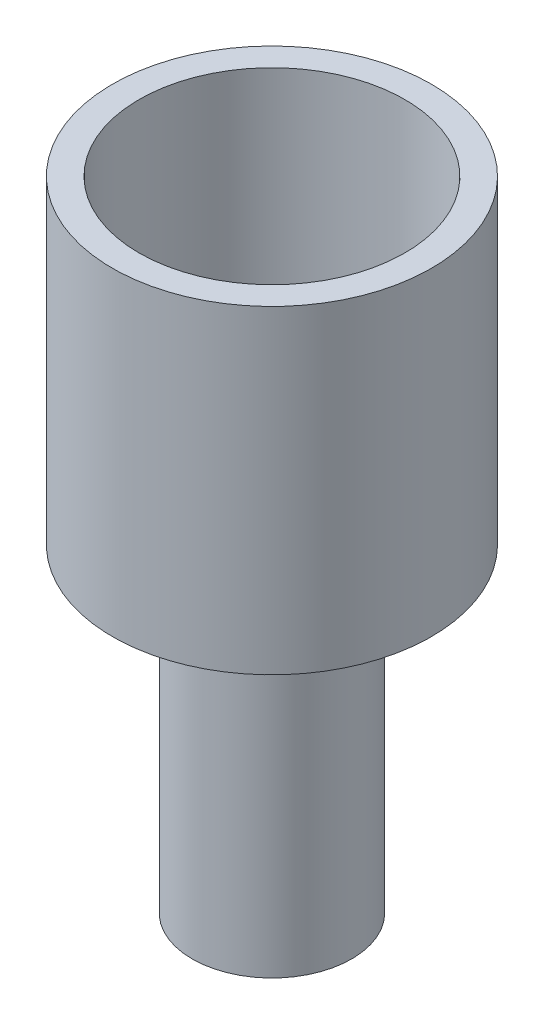
ISO-10303-21;
HEADER;
FILE_DESCRIPTION(('STEP AP214'),'2;1');
FILE_NAME('part.step','',(''),(''),'','','');
FILE_SCHEMA(('AUTOMOTIVE_DESIGN { 1 0 10303 214 1 1 1 1 }'));
ENDSEC;
DATA;
#1=APPLICATION_CONTEXT('core data for automotive mechanical design processes');
#2=APPLICATION_PROTOCOL_DEFINITION('international standard','automotive_design',2000,#1);
#3=PRODUCT_CONTEXT('',#1,'mechanical');
#4=PRODUCT('Part','Part','',(#3));
#5=PRODUCT_RELATED_PRODUCT_CATEGORY('part','',(#4));
#6=PRODUCT_DEFINITION_FORMATION('','',#4);
#7=PRODUCT_DEFINITION_CONTEXT('part definition',#1,'design');
#8=PRODUCT_DEFINITION('design','',#6,#7);
#9=PRODUCT_DEFINITION_SHAPE('','',#8);
#10=(LENGTH_UNIT() NAMED_UNIT(*) SI_UNIT(.MILLI.,.METRE.));
#11=(NAMED_UNIT(*) PLANE_ANGLE_UNIT() SI_UNIT($,.RADIAN.));
#12=(NAMED_UNIT(*) SI_UNIT($,.STERADIAN.) SOLID_ANGLE_UNIT());
#13=UNCERTAINTY_MEASURE_WITH_UNIT(LENGTH_MEASURE(1.E-05),#10,'distance_accuracy_value','');
#14=(GEOMETRIC_REPRESENTATION_CONTEXT(3) GLOBAL_UNCERTAINTY_ASSIGNED_CONTEXT((#13)) GLOBAL_UNIT_ASSIGNED_CONTEXT((#10,
#11,#12)) REPRESENTATION_CONTEXT('',''));
#15=CARTESIAN_POINT('',(0.,0.,0.));
#16=DIRECTION('',(0.,0.,1.));
#17=DIRECTION('',(1.,0.,0.));
#18=AXIS2_PLACEMENT_3D('',#15,#16,#17);
#19=CARTESIAN_POINT('',(0.,0.,0.));
#20=DIRECTION('',(0.,1.,0.));
#21=DIRECTION('',(0.,0.,1.));
#22=AXIS2_PLACEMENT_3D('',#19,#20,#21);
#23=PLANE('',#22);
#24=CARTESIAN_POINT('',(0.,0.,0.));
#25=DIRECTION('',(0.,1.,0.));
#26=DIRECTION('',(0.,0.,1.));
#27=AXIS2_PLACEMENT_3D('',#24,#25,#26);
#28=CIRCLE('',#27,4.7625);
#29=CARTESIAN_POINT('',(0.,0.,4.7625));
#30=VERTEX_POINT('',#29);
#31=EDGE_CURVE('E74',#30,#30,#28,.T.);
#32=ORIENTED_EDGE('',*,*,#31,.T.);
#33=EDGE_LOOP('',(#32));
#34=FACE_BOUND('',#33,.T.);
#35=CARTESIAN_POINT('',(0.,0.,0.));
#36=DIRECTION('',(0.,1.,0.));
#37=DIRECTION('',(0.,0.,1.));
#38=AXIS2_PLACEMENT_3D('',#35,#36,#37);
#39=CIRCLE('',#38,9.525);
#40=CARTESIAN_POINT('',(0.,0.,-9.525));
#41=VERTEX_POINT('',#40);
#42=EDGE_CURVE('E65',#41,#41,#39,.T.);
#43=ORIENTED_EDGE('',*,*,#42,.F.);
#44=EDGE_LOOP('',(#43));
#45=FACE_BOUND('',#44,.T.);
#46=ADVANCED_FACE('F61',(#34,#45),#23,.F.);
#47=CARTESIAN_POINT('',(0.,19.05,0.));
#48=DIRECTION('',(0.,-1.,0.));
#49=DIRECTION('',(0.,0.,-1.));
#50=AXIS2_PLACEMENT_3D('',#47,#48,#49);
#51=CYLINDRICAL_SURFACE('',#50,9.525);
#52=CARTESIAN_POINT('',(0.,19.05,0.));
#53=DIRECTION('',(0.,1.,0.));
#54=DIRECTION('',(0.,0.,1.));
#55=AXIS2_PLACEMENT_3D('',#52,#53,#54);
#56=CIRCLE('',#55,9.525);
#57=CARTESIAN_POINT('',(0.,19.05,-9.525));
#58=VERTEX_POINT('',#57);
#59=EDGE_CURVE('E11',#58,#58,#56,.T.);
#60=CARTESIAN_POINT('',(0.,19.05,-9.525));
#61=CARTESIAN_POINT('',(0.,18.8515625,-9.525));
#62=CARTESIAN_POINT('',(0.,18.653125,-9.525));
#63=CARTESIAN_POINT('',(0.,18.25625,-9.525));
#64=CARTESIAN_POINT('',(0.,18.0578125,-9.525));
#65=CARTESIAN_POINT('',(0.,17.6609375,-9.525));
#66=CARTESIAN_POINT('',(0.,17.4625,-9.525));
#67=CARTESIAN_POINT('',(0.,17.065625,-9.525));
#68=CARTESIAN_POINT('',(0.,16.8671875,-9.525));
#69=CARTESIAN_POINT('',(0.,16.4703125,-9.525));
#70=CARTESIAN_POINT('',(0.,16.271875,-9.525));
#71=CARTESIAN_POINT('',(0.,15.875,-9.525));
#72=CARTESIAN_POINT('',(0.,15.6765625,-9.525));
#73=CARTESIAN_POINT('',(0.,15.2796875,-9.525));
#74=CARTESIAN_POINT('',(0.,15.08125,-9.525));
#75=CARTESIAN_POINT('',(0.,14.684375,-9.525));
#76=CARTESIAN_POINT('',(0.,14.4859375,-9.525));
#77=CARTESIAN_POINT('',(0.,14.0890625,-9.525));
#78=CARTESIAN_POINT('',(0.,13.890625,-9.525));
#79=CARTESIAN_POINT('',(0.,13.49375,-9.525));
#80=CARTESIAN_POINT('',(0.,13.2953125,-9.525));
#81=CARTESIAN_POINT('',(0.,12.8984375,-9.525));
#82=CARTESIAN_POINT('',(0.,12.7,-9.525));
#83=CARTESIAN_POINT('',(0.,12.303125,-9.525));
#84=CARTESIAN_POINT('',(0.,12.1046875,-9.525));
#85=CARTESIAN_POINT('',(0.,11.7078125,-9.525));
#86=CARTESIAN_POINT('',(0.,11.509375,-9.525));
#87=CARTESIAN_POINT('',(0.,11.1125,-9.525));
#88=CARTESIAN_POINT('',(0.,10.9140625,-9.525));
#89=CARTESIAN_POINT('',(0.,10.5171875,-9.525));
#90=CARTESIAN_POINT('',(0.,10.31875,-9.525));
#91=CARTESIAN_POINT('',(0.,9.921875,-9.525));
#92=CARTESIAN_POINT('',(0.,9.7234375,-9.525));
#93=CARTESIAN_POINT('',(0.,9.3265625,-9.525));
#94=CARTESIAN_POINT('',(0.,9.128125,-9.525));
#95=CARTESIAN_POINT('',(0.,8.73125,-9.525));
#96=CARTESIAN_POINT('',(0.,8.5328125,-9.525));
#97=CARTESIAN_POINT('',(0.,8.1359375,-9.525));
#98=CARTESIAN_POINT('',(0.,7.9375,-9.525));
#99=CARTESIAN_POINT('',(0.,7.540625,-9.525));
#100=CARTESIAN_POINT('',(0.,7.3421875,-9.525));
#101=CARTESIAN_POINT('',(0.,6.9453125,-9.525));
#102=CARTESIAN_POINT('',(0.,6.746875,-9.525));
#103=CARTESIAN_POINT('',(0.,6.35,-9.525));
#104=CARTESIAN_POINT('',(0.,6.1515625,-9.525));
#105=CARTESIAN_POINT('',(0.,5.7546875,-9.525));
#106=CARTESIAN_POINT('',(0.,5.55625,-9.525));
#107=CARTESIAN_POINT('',(0.,5.159375,-9.525));
#108=CARTESIAN_POINT('',(0.,4.9609375,-9.525));
#109=CARTESIAN_POINT('',(0.,4.5640625,-9.525));
#110=CARTESIAN_POINT('',(0.,4.365625,-9.525));
#111=CARTESIAN_POINT('',(0.,3.96875,-9.525));
#112=CARTESIAN_POINT('',(0.,3.7703125,-9.525));
#113=CARTESIAN_POINT('',(0.,3.3734375,-9.525));
#114=CARTESIAN_POINT('',(0.,3.175,-9.525));
#115=CARTESIAN_POINT('',(0.,2.778125,-9.525));
#116=CARTESIAN_POINT('',(0.,2.5796875,-9.525));
#117=CARTESIAN_POINT('',(0.,2.1828125,-9.525));
#118=CARTESIAN_POINT('',(0.,1.984375,-9.525));
#119=CARTESIAN_POINT('',(0.,1.5875,-9.525));
#120=CARTESIAN_POINT('',(0.,1.3890625,-9.525));
#121=CARTESIAN_POINT('',(0.,0.992187500000001,-9.525));
#122=CARTESIAN_POINT('',(0.,0.793750000000001,-9.525));
#123=CARTESIAN_POINT('',(0.,0.396875,-9.525));
#124=CARTESIAN_POINT('',(0.,0.1984375,-9.525));
#125=CARTESIAN_POINT('',(0.,0.,-9.525));
#126=B_SPLINE_CURVE_WITH_KNOTS('',3,(#60,#61,#62,#63,#64,#65,#66,#67,#68,#69,#70,#71,#72,#73,
#74,#75,#76,#77,#78,#79,#80,#81,#82,#83,#84,#85,#86,#87,#88,#89,#90,#91,#92,#93,#94,#95,#96,#97,
#98,#99,#100,#101,#102,#103,#104,#105,#106,#107,#108,#109,#110,#111,#112,#113,#114,#115,#116,
#117,#118,#119,#120,#121,#122,#123,#124,#125),.UNSPECIFIED.,.F.,.F.,(4,2,2,2,2,2,2,2,2,2,2,2,2,
2,2,2,2,2,2,2,2,2,2,2,2,2,2,2,2,2,2,2,4),(0.,0.5953125,1.190625,1.7859375,2.38125,2.9765625,
3.571875,4.1671875,4.7625,5.3578125,5.953125,6.5484375,7.14375,7.7390625,8.334375,8.9296875,
9.525,10.1203125,10.715625,11.3109375,11.90625,12.5015625,13.096875,13.6921875,14.2875,
14.8828125,15.478125,16.0734375,16.66875,17.2640625,17.859375,18.4546875,19.05),.UNSPECIFIED.);
#127=EDGE_CURVE('BSEAM63',#58,#41,#126,.T.);
#128=ORIENTED_EDGE('',*,*,#59,.F.);
#129=ORIENTED_EDGE('',*,*,#42,.T.);
#130=ORIENTED_EDGE('',*,*,#127,.T.);
#131=ORIENTED_EDGE('',*,*,#127,.F.);
#132=EDGE_LOOP('',(#128,#130,#129,#131));
#133=FACE_BOUND('',#132,.T.);
#134=ADVANCED_FACE('F63',(#133),#51,.T.);
#135=CARTESIAN_POINT('',(0.,19.05,0.));
#136=DIRECTION('',(0.,1.,0.));
#137=DIRECTION('',(0.,0.,1.));
#138=AXIS2_PLACEMENT_3D('',#135,#136,#137);
#139=PLANE('',#138);
#140=CARTESIAN_POINT('',(0.,19.05,0.));
#141=DIRECTION('',(0.,1.,0.));
#142=DIRECTION('',(0.,0.,1.));
#143=AXIS2_PLACEMENT_3D('',#140,#141,#142);
#144=CIRCLE('',#143,7.9375);
#145=CARTESIAN_POINT('',(0.,19.05,7.9375));
#146=VERTEX_POINT('',#145);
#147=EDGE_CURVE('E82',#146,#146,#144,.T.);
#148=ORIENTED_EDGE('',*,*,#147,.F.);
#149=EDGE_LOOP('',(#148));
#150=FACE_BOUND('',#149,.T.);
#151=ORIENTED_EDGE('',*,*,#59,.T.);
#152=EDGE_LOOP('',(#151));
#153=FACE_BOUND('',#152,.T.);
#154=ADVANCED_FACE('F105',(#150,#153),#139,.T.);
#155=CARTESIAN_POINT('',(0.,-19.05,0.));
#156=DIRECTION('',(0.,1.,0.));
#157=DIRECTION('',(0.,0.,1.));
#158=AXIS2_PLACEMENT_3D('',#155,#156,#157);
#159=CYLINDRICAL_SURFACE('',#158,4.7625);
#160=CARTESIAN_POINT('',(0.,-19.05,0.));
#161=DIRECTION('',(0.,1.,0.));
#162=DIRECTION('',(0.,0.,1.));
#163=AXIS2_PLACEMENT_3D('',#160,#161,#162);
#164=CIRCLE('',#163,4.7625);
#165=CARTESIAN_POINT('',(0.,-19.05,4.7625));
#166=VERTEX_POINT('',#165);
#167=EDGE_CURVE('E72',#166,#166,#164,.T.);
#168=CARTESIAN_POINT('',(0.,-19.05,4.7625));
#169=CARTESIAN_POINT('',(0.,-18.8515625,4.7625));
#170=CARTESIAN_POINT('',(0.,-18.653125,4.7625));
#171=CARTESIAN_POINT('',(0.,-18.25625,4.7625));
#172=CARTESIAN_POINT('',(0.,-18.0578125,4.7625));
#173=CARTESIAN_POINT('',(0.,-17.6609375,4.7625));
#174=CARTESIAN_POINT('',(0.,-17.4625,4.7625));
#175=CARTESIAN_POINT('',(0.,-17.065625,4.7625));
#176=CARTESIAN_POINT('',(0.,-16.8671875,4.7625));
#177=CARTESIAN_POINT('',(0.,-16.4703125,4.7625));
#178=CARTESIAN_POINT('',(0.,-16.271875,4.7625));
#179=CARTESIAN_POINT('',(0.,-15.875,4.7625));
#180=CARTESIAN_POINT('',(0.,-15.6765625,4.7625));
#181=CARTESIAN_POINT('',(0.,-15.2796875,4.7625));
#182=CARTESIAN_POINT('',(0.,-15.08125,4.7625));
#183=CARTESIAN_POINT('',(0.,-14.684375,4.7625));
#184=CARTESIAN_POINT('',(0.,-14.4859375,4.7625));
#185=CARTESIAN_POINT('',(0.,-14.0890625,4.7625));
#186=CARTESIAN_POINT('',(0.,-13.890625,4.7625));
#187=CARTESIAN_POINT('',(0.,-13.49375,4.7625));
#188=CARTESIAN_POINT('',(0.,-13.2953125,4.7625));
#189=CARTESIAN_POINT('',(0.,-12.8984375,4.7625));
#190=CARTESIAN_POINT('',(0.,-12.7,4.7625));
#191=CARTESIAN_POINT('',(0.,-12.303125,4.7625));
#192=CARTESIAN_POINT('',(0.,-12.1046875,4.7625));
#193=CARTESIAN_POINT('',(0.,-11.7078125,4.7625));
#194=CARTESIAN_POINT('',(0.,-11.509375,4.7625));
#195=CARTESIAN_POINT('',(0.,-11.1125,4.7625));
#196=CARTESIAN_POINT('',(0.,-10.9140625,4.7625));
#197=CARTESIAN_POINT('',(0.,-10.5171875,4.7625));
#198=CARTESIAN_POINT('',(0.,-10.31875,4.7625));
#199=CARTESIAN_POINT('',(0.,-9.921875,4.7625));
#200=CARTESIAN_POINT('',(0.,-9.7234375,4.7625));
#201=CARTESIAN_POINT('',(0.,-9.3265625,4.7625));
#202=CARTESIAN_POINT('',(0.,-9.128125,4.7625));
#203=CARTESIAN_POINT('',(0.,-8.73125,4.7625));
#204=CARTESIAN_POINT('',(0.,-8.5328125,4.7625));
#205=CARTESIAN_POINT('',(0.,-8.1359375,4.7625));
#206=CARTESIAN_POINT('',(0.,-7.9375,4.7625));
#207=CARTESIAN_POINT('',(0.,-7.540625,4.7625));
#208=CARTESIAN_POINT('',(0.,-7.3421875,4.7625));
#209=CARTESIAN_POINT('',(0.,-6.9453125,4.7625));
#210=CARTESIAN_POINT('',(0.,-6.746875,4.7625));
#211=CARTESIAN_POINT('',(0.,-6.35,4.7625));
#212=CARTESIAN_POINT('',(0.,-6.1515625,4.7625));
#213=CARTESIAN_POINT('',(0.,-5.7546875,4.7625));
#214=CARTESIAN_POINT('',(0.,-5.55625,4.7625));
#215=CARTESIAN_POINT('',(0.,-5.159375,4.7625));
#216=CARTESIAN_POINT('',(0.,-4.9609375,4.7625));
#217=CARTESIAN_POINT('',(0.,-4.5640625,4.7625));
#218=CARTESIAN_POINT('',(0.,-4.365625,4.7625));
#219=CARTESIAN_POINT('',(0.,-3.96875,4.7625));
#220=CARTESIAN_POINT('',(0.,-3.7703125,4.7625));
#221=CARTESIAN_POINT('',(0.,-3.3734375,4.7625));
#222=CARTESIAN_POINT('',(0.,-3.175,4.7625));
#223=CARTESIAN_POINT('',(0.,-2.778125,4.7625));
#224=CARTESIAN_POINT('',(0.,-2.5796875,4.7625));
#225=CARTESIAN_POINT('',(0.,-2.1828125,4.7625));
#226=CARTESIAN_POINT('',(0.,-1.984375,4.7625));
#227=CARTESIAN_POINT('',(0.,-1.5875,4.7625));
#228=CARTESIAN_POINT('',(0.,-1.3890625,4.7625));
#229=CARTESIAN_POINT('',(0.,-0.992187500000001,4.7625));
#230=CARTESIAN_POINT('',(0.,-0.793750000000001,4.7625));
#231=CARTESIAN_POINT('',(0.,-0.396875,4.7625));
#232=CARTESIAN_POINT('',(0.,-0.1984375,4.7625));
#233=CARTESIAN_POINT('',(0.,0.,4.7625));
#234=B_SPLINE_CURVE_WITH_KNOTS('',3,(#168,#169,#170,#171,#172,#173,#174,#175,#176,#177,#178,
#179,#180,#181,#182,#183,#184,#185,#186,#187,#188,#189,#190,#191,#192,#193,#194,#195,#196,#197,
#198,#199,#200,#201,#202,#203,#204,#205,#206,#207,#208,#209,#210,#211,#212,#213,#214,#215,#216,
#217,#218,#219,#220,#221,#222,#223,#224,#225,#226,#227,#228,#229,#230,#231,#232,#233),
.UNSPECIFIED.,.F.,.F.,(4,2,2,2,2,2,2,2,2,2,2,2,2,2,2,2,2,2,2,2,2,2,2,2,2,2,2,2,2,2,2,2,4),(0.,
0.595312499999997,1.190625,1.7859375,2.38125,2.9765625,3.571875,4.1671875,4.7625,5.3578125,
5.953125,6.5484375,7.14375,7.7390625,8.334375,8.9296875,9.525,10.1203125,10.715625,11.3109375,
11.90625,12.5015625,13.096875,13.6921875,14.2875,14.8828125,15.478125,16.0734375,16.66875,
17.2640625,17.859375,18.4546875,19.05),.UNSPECIFIED.);
#235=EDGE_CURVE('BSEAM99',#166,#30,#234,.T.);
#236=ORIENTED_EDGE('',*,*,#167,.T.);
#237=ORIENTED_EDGE('',*,*,#31,.F.);
#238=ORIENTED_EDGE('',*,*,#235,.T.);
#239=ORIENTED_EDGE('',*,*,#235,.F.);
#240=EDGE_LOOP('',(#236,#238,#237,#239));
#241=FACE_BOUND('',#240,.T.);
#242=ADVANCED_FACE('F99',(#241),#159,.T.);
#243=CARTESIAN_POINT('',(0.,-19.05,0.));
#244=DIRECTION('',(0.,1.,0.));
#245=DIRECTION('',(0.,0.,1.));
#246=AXIS2_PLACEMENT_3D('',#243,#244,#245);
#247=PLANE('',#246);
#248=CARTESIAN_POINT('',(0.,-19.05,0.));
#249=DIRECTION('',(0.,-1.,0.));
#250=DIRECTION('',(0.,0.,-1.));
#251=AXIS2_PLACEMENT_3D('',#248,#249,#250);
#252=CIRCLE('',#251,3.17499999999999);
#253=CARTESIAN_POINT('',(0.,-19.05,-3.17499999999999));
#254=VERTEX_POINT('',#253);
#255=EDGE_CURVE('E88',#254,#254,#252,.T.);
#256=ORIENTED_EDGE('',*,*,#255,.F.);
#257=EDGE_LOOP('',(#256));
#258=FACE_BOUND('',#257,.T.);
#259=ORIENTED_EDGE('',*,*,#167,.F.);
#260=EDGE_LOOP('',(#259));
#261=FACE_BOUND('',#260,.T.);
#262=ADVANCED_FACE('F95',(#258,#261),#247,.F.);
#263=CARTESIAN_POINT('',(0.,4.76933116353127,0.));
#264=DIRECTION('',(0.,1.,0.));
#265=DIRECTION('',(0.,0.,1.));
#266=AXIS2_PLACEMENT_3D('',#263,#264,#265);
#267=CONICAL_SURFACE('',#266,7.9375,1.02974425867665);
#268=CARTESIAN_POINT('',(0.,1.9077324654125,0.));
#269=DIRECTION('',(0.,1.,0.));
#270=DIRECTION('',(0.,0.,1.));
#271=AXIS2_PLACEMENT_3D('',#268,#269,#270);
#272=CIRCLE('',#271,3.17499999999999);
#273=CARTESIAN_POINT('',(0.,1.9077324654125,3.17499999999999));
#274=VERTEX_POINT('',#273);
#275=EDGE_CURVE('E85',#274,#274,#272,.F.);
#276=ORIENTED_EDGE('',*,*,#275,.T.);
#277=EDGE_LOOP('',(#276));
#278=FACE_BOUND('',#277,.T.);
#279=CARTESIAN_POINT('',(0.,4.76933116353127,0.));
#280=DIRECTION('',(0.,1.,0.));
#281=DIRECTION('',(0.,0.,1.));
#282=AXIS2_PLACEMENT_3D('',#279,#280,#281);
#283=CIRCLE('',#282,7.9375);
#284=CARTESIAN_POINT('',(0.,4.76933116353127,7.9375));
#285=VERTEX_POINT('',#284);
#286=EDGE_CURVE('E77',#285,#285,#283,.T.);
#287=ORIENTED_EDGE('',*,*,#286,.T.);
#288=EDGE_LOOP('',(#287));
#289=FACE_BOUND('',#288,.T.);
#290=ADVANCED_FACE('F98',(#278,#289),#267,.F.);
#291=CARTESIAN_POINT('',(0.,19.05,0.));
#292=DIRECTION('',(0.,1.,0.));
#293=DIRECTION('',(0.,0.,1.));
#294=AXIS2_PLACEMENT_3D('',#291,#292,#293);
#295=CYLINDRICAL_SURFACE('',#294,7.9375);
#296=ORIENTED_EDGE('',*,*,#286,.F.);
#297=EDGE_LOOP('',(#296));
#298=FACE_BOUND('',#297,.T.);
#299=ORIENTED_EDGE('',*,*,#147,.T.);
#300=EDGE_LOOP('',(#299));
#301=FACE_BOUND('',#300,.T.);
#302=ADVANCED_FACE('F127',(#298,#301),#295,.F.);
#303=CARTESIAN_POINT('',(0.,-19.05,0.));
#304=DIRECTION('',(0.,-1.,0.));
#305=DIRECTION('',(0.,0.,-1.));
#306=AXIS2_PLACEMENT_3D('',#303,#304,#305);
#307=CYLINDRICAL_SURFACE('',#306,3.17499999999999);
#308=ORIENTED_EDGE('',*,*,#255,.T.);
#309=EDGE_LOOP('',(#308));
#310=FACE_BOUND('',#309,.T.);
#311=ORIENTED_EDGE('',*,*,#275,.F.);
#312=EDGE_LOOP('',(#311));
#313=FACE_BOUND('',#312,.T.);
#314=ADVANCED_FACE('F92',(#310,#313),#307,.F.);
#315=CLOSED_SHELL('',(#46,#134,#154,#242,#262,#290,#302,#314));
#316=MANIFOLD_SOLID_BREP('B2',#315);
#317=ADVANCED_BREP_SHAPE_REPRESENTATION('',(#18,#316),#14);
#318=SHAPE_DEFINITION_REPRESENTATION(#9,#317);
ENDSEC;
END-ISO-10303-21;
